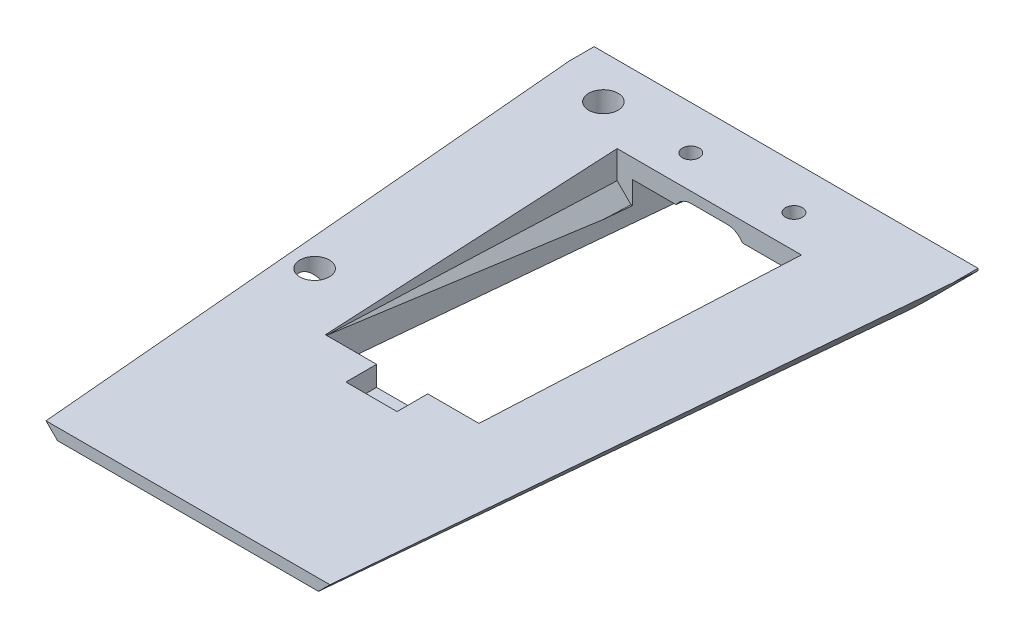
ISO-10303-21;
HEADER;
FILE_DESCRIPTION(('STEP AP214'),'2;1');
FILE_NAME('part.step','',(''),(''),'','','');
FILE_SCHEMA(('AUTOMOTIVE_DESIGN { 1 0 10303 214 1 1 1 1 }'));
ENDSEC;
DATA;
#1=APPLICATION_CONTEXT('core data for automotive mechanical design processes');
#2=APPLICATION_PROTOCOL_DEFINITION('international standard','automotive_design',2000,#1);
#3=PRODUCT_CONTEXT('',#1,'mechanical');
#4=PRODUCT('Part','Part','',(#3));
#5=PRODUCT_RELATED_PRODUCT_CATEGORY('part','',(#4));
#6=PRODUCT_DEFINITION_FORMATION('','',#4);
#7=PRODUCT_DEFINITION_CONTEXT('part definition',#1,'design');
#8=PRODUCT_DEFINITION('design','',#6,#7);
#9=PRODUCT_DEFINITION_SHAPE('','',#8);
#10=(LENGTH_UNIT() NAMED_UNIT(*) SI_UNIT(.MILLI.,.METRE.));
#11=(NAMED_UNIT(*) PLANE_ANGLE_UNIT() SI_UNIT($,.RADIAN.));
#12=(NAMED_UNIT(*) SI_UNIT($,.STERADIAN.) SOLID_ANGLE_UNIT());
#13=UNCERTAINTY_MEASURE_WITH_UNIT(LENGTH_MEASURE(1.E-05),#10,'distance_accuracy_value','');
#14=(GEOMETRIC_REPRESENTATION_CONTEXT(3) GLOBAL_UNCERTAINTY_ASSIGNED_CONTEXT((#13)) GLOBAL_UNIT_ASSIGNED_CONTEXT((#10,
#11,#12)) REPRESENTATION_CONTEXT('',''));
#15=CARTESIAN_POINT('',(0.,0.,0.));
#16=DIRECTION('',(0.,0.,1.));
#17=DIRECTION('',(1.,0.,0.));
#18=AXIS2_PLACEMENT_3D('',#15,#16,#17);
#19=CARTESIAN_POINT('',(166.967269218127,-18.293667746887,-89.9054333669881));
#20=DIRECTION('',(0.,-0.996194698091746,0.0871557427476512));
#21=DIRECTION('',(0.,-0.0871557427476512,-0.996194698091746));
#22=AXIS2_PLACEMENT_3D('',#19,#20,#21);
#23=PLANE('',#22);
#24=CARTESIAN_POINT('',(173.869198236725,-18.7930616119819,-95.6135313647014));
#25=DIRECTION('',(0.,-0.996194698091746,0.0871557427476512));
#26=DIRECTION('',(0.,0.0871557427476512,0.996194698091746));
#27=AXIS2_PLACEMENT_3D('',#24,#25,#26);
#28=ELLIPSE('',#27,1.65630273194654,1.65000000000002);
#29=CARTESIAN_POINT('',(173.869198236725,-18.6487053171641,-93.9635313647014));
#30=VERTEX_POINT('',#29);
#31=EDGE_CURVE('E272',#30,#30,#28,.T.);
#32=ORIENTED_EDGE('',*,*,#31,.F.);
#33=EDGE_LOOP('',(#32));
#34=FACE_BOUND('',#33,.T.);
#35=DIRECTION('',(0.,-0.0871557427476512,-0.996194698091746));
#36=VECTOR('',#35,1.);
#37=CARTESIAN_POINT('',(170.263380121477,-16.9256783104184,-74.2692425585265));
#38=LINE('',#37,#36);
#39=CARTESIAN_POINT('',(170.263380121477,-19.540350592848,-104.155083501279));
#40=VERTEX_POINT('',#39);
#41=CARTESIAN_POINT('',(170.263380121477,-18.2280206399592,-89.1550835012789));
#42=VERTEX_POINT('',#41);
#43=EDGE_CURVE('E438',#40,#42,#38,.F.);
#44=ORIENTED_EDGE('',*,*,#43,.F.);
#45=DIRECTION('',(-1.,0.,0.));
#46=VECTOR('',#45,1.);
#47=CARTESIAN_POINT('',(178.792269218127,-19.540350592848,-104.155083501279));
#48=LINE('',#47,#46);
#49=CARTESIAN_POINT('',(178.792269218127,-19.540350592848,-104.155083501279));
#50=VERTEX_POINT('',#49);
#51=EDGE_CURVE('E297',#50,#40,#48,.T.);
#52=ORIENTED_EDGE('',*,*,#51,.F.);
#53=DIRECTION('',(0.,-0.0871557427476512,-0.996194698091746));
#54=VECTOR('',#53,1.);
#55=CARTESIAN_POINT('',(178.792269218127,-19.7929134595742,-107.041890277695));
#56=LINE('',#55,#54);
#57=CARTESIAN_POINT('',(178.792269218127,-18.2280206399592,-89.1550835012789));
#58=VERTEX_POINT('',#57);
#59=EDGE_CURVE('E301',#58,#50,#56,.T.);
#60=ORIENTED_EDGE('',*,*,#59,.F.);
#61=DIRECTION('',(1.,0.,0.));
#62=VECTOR('',#61,1.);
#63=CARTESIAN_POINT('',(178.792269218127,-18.2280206399592,-89.1550835012789));
#64=LINE('',#63,#62);
#65=EDGE_CURVE('E307',#42,#58,#64,.T.);
#66=ORIENTED_EDGE('',*,*,#65,.F.);
#67=EDGE_LOOP('',(#44,#52,#60,#66));
#68=FACE_BOUND('',#67,.T.);
#69=ADVANCED_FACE('F36',(#34,#68),#23,.T.);
#70=CARTESIAN_POINT('',(0.,-14.5,0.));
#71=DIRECTION('',(0.,1.,0.));
#72=DIRECTION('',(0.,0.,1.));
#73=AXIS2_PLACEMENT_3D('',#70,#71,#72);
#74=PLANE('',#73);
#75=DIRECTION('',(0.,0.,-1.));
#76=VECTOR('',#75,1.);
#77=CARTESIAN_POINT('',(168.792269218127,-14.5000000000001,-23.1550835012789));
#78=LINE('',#77,#76);
#79=CARTESIAN_POINT('',(168.792269218127,-14.5000000000001,-23.1550835012789));
#80=VERTEX_POINT('',#79);
#81=CARTESIAN_POINT('',(168.792269218127,-14.5000000000001,-29.1550835012789));
#82=VERTEX_POINT('',#81);
#83=EDGE_CURVE('E259',#80,#82,#78,.T.);
#84=ORIENTED_EDGE('',*,*,#83,.F.);
#85=DIRECTION('',(1.,0.,0.));
#86=VECTOR('',#85,1.);
#87=CARTESIAN_POINT('',(168.792269218127,-14.5000000000001,-23.1550835012789));
#88=LINE('',#87,#86);
#89=CARTESIAN_POINT('',(158.792269218127,-14.5000000000001,-23.1550835012789));
#90=VERTEX_POINT('',#89);
#91=EDGE_CURVE('E237',#90,#80,#88,.T.);
#92=ORIENTED_EDGE('',*,*,#91,.F.);
#93=DIRECTION('',(0.,0.,-1.));
#94=VECTOR('',#93,1.);
#95=CARTESIAN_POINT('',(158.792269218127,-14.5000000000001,-23.1550835012789));
#96=LINE('',#95,#94);
#97=CARTESIAN_POINT('',(158.792269218127,-14.5000000000001,-29.1550835012789));
#98=VERTEX_POINT('',#97);
#99=EDGE_CURVE('E262',#90,#98,#96,.T.);
#100=ORIENTED_EDGE('',*,*,#99,.T.);
#101=DIRECTION('',(1.,0.,0.));
#102=VECTOR('',#101,1.);
#103=CARTESIAN_POINT('',(148.792269218127,-14.5,-29.1550835012789));
#104=LINE('',#103,#102);
#105=CARTESIAN_POINT('',(148.792269218127,-14.5,-29.1550835012789));
#106=VERTEX_POINT('',#105);
#107=EDGE_CURVE('E354',#106,#98,#104,.T.);
#108=ORIENTED_EDGE('',*,*,#107,.F.);
#109=DIRECTION('',(0.0499376169438923,0.,0.998752338877845));
#110=VECTOR('',#109,1.);
#111=CARTESIAN_POINT('',(145.792269218127,-14.5,-89.1550835012789));
#112=LINE('',#111,#110);
#113=CARTESIAN_POINT('',(145.792269218127,-14.5,-89.1550835012789));
#114=VERTEX_POINT('',#113);
#115=EDGE_CURVE('E346',#114,#106,#112,.T.);
#116=ORIENTED_EDGE('',*,*,#115,.F.);
#117=DIRECTION('',(-1.,0.,0.));
#118=VECTOR('',#117,1.);
#119=CARTESIAN_POINT('',(145.792269218127,-14.5,-89.1550835012789));
#120=LINE('',#119,#118);
#121=CARTESIAN_POINT('',(181.792269218127,-14.5,-89.1550835012789));
#122=VERTEX_POINT('',#121);
#123=EDGE_CURVE('E347',#122,#114,#120,.T.);
#124=ORIENTED_EDGE('',*,*,#123,.F.);
#125=DIRECTION('',(0.0499376169438923,0.,-0.998752338877845));
#126=VECTOR('',#125,1.);
#127=CARTESIAN_POINT('',(181.792269218127,-14.5,-89.1550835012789));
#128=LINE('',#127,#126);
#129=CARTESIAN_POINT('',(178.792269218127,-14.5,-29.1550835012789));
#130=VERTEX_POINT('',#129);
#131=EDGE_CURVE('E351',#130,#122,#128,.T.);
#132=ORIENTED_EDGE('',*,*,#131,.F.);
#133=EDGE_CURVE('E357',#82,#130,#104,.T.);
#134=ORIENTED_EDGE('',*,*,#133,.F.);
#135=EDGE_LOOP('',(#84,#92,#100,#108,#116,#124,#132,#134));
#136=FACE_BOUND('',#135,.T.);
#137=CARTESIAN_POINT('',(173.869198236725,-14.5,-95.6135313647014));
#138=DIRECTION('',(0.,1.,0.));
#139=DIRECTION('',(0.,0.,1.));
#140=AXIS2_PLACEMENT_3D('',#137,#138,#139);
#141=CIRCLE('',#140,1.65000000000002);
#142=CARTESIAN_POINT('',(173.869198236725,-14.5,-93.9635313647014));
#143=VERTEX_POINT('',#142);
#144=EDGE_CURVE('E266',#143,#143,#141,.T.);
#145=ORIENTED_EDGE('',*,*,#144,.F.);
#146=EDGE_LOOP('',(#145));
#147=FACE_BOUND('',#146,.T.);
#148=CARTESIAN_POINT('',(153.715340199529,-14.5,-95.6135313647014));
#149=DIRECTION('',(0.,1.,0.));
#150=DIRECTION('',(0.,0.,1.));
#151=AXIS2_PLACEMENT_3D('',#148,#149,#150);
#152=CIRCLE('',#151,1.65000000000002);
#153=CARTESIAN_POINT('',(153.715340199529,-14.5,-93.9635313647014));
#154=VERTEX_POINT('',#153);
#155=EDGE_CURVE('E261',#154,#154,#152,.T.);
#156=ORIENTED_EDGE('',*,*,#155,.F.);
#157=EDGE_LOOP('',(#156));
#158=FACE_BOUND('',#157,.T.);
#159=CARTESIAN_POINT('',(136.518193503687,-14.5,-39.3205639037492));
#160=DIRECTION('',(0.,1.,0.));
#161=DIRECTION('',(0.,0.,1.));
#162=AXIS2_PLACEMENT_3D('',#159,#160,#161);
#163=CIRCLE('',#162,2.87499999999999);
#164=CARTESIAN_POINT('',(136.518193503687,-14.5,-36.4455639037492));
#165=VERTEX_POINT('',#164);
#166=EDGE_CURVE('E336',#165,#165,#163,.T.);
#167=ORIENTED_EDGE('',*,*,#166,.F.);
#168=EDGE_LOOP('',(#167));
#169=FACE_BOUND('',#168,.T.);
#170=CARTESIAN_POINT('',(136.518193503687,-14.5,-95.7385326925261));
#171=DIRECTION('',(0.,1.,0.));
#172=DIRECTION('',(0.,0.,1.));
#173=AXIS2_PLACEMENT_3D('',#170,#171,#172);
#174=CIRCLE('',#173,2.87499999999999);
#175=CARTESIAN_POINT('',(136.518193503687,-14.5,-92.8635326925261));
#176=VERTEX_POINT('',#175);
#177=EDGE_CURVE('E337',#176,#176,#174,.T.);
#178=ORIENTED_EDGE('',*,*,#177,.F.);
#179=EDGE_LOOP('',(#178));
#180=FACE_BOUND('',#179,.T.);
#181=DIRECTION('',(0.,0.,1.));
#182=VECTOR('',#181,1.);
#183=CARTESIAN_POINT('',(201.292269218127,-14.5,-104.155083501279));
#184=LINE('',#183,#182);
#185=CARTESIAN_POINT('',(201.292269218127,-14.5,-104.155083501279));
#186=VERTEX_POINT('',#185);
#187=CARTESIAN_POINT('',(201.292269218127,-14.5,-99.3226935308539));
#188=VERTEX_POINT('',#187);
#189=EDGE_CURVE('E378',#186,#188,#184,.T.);
#190=ORIENTED_EDGE('',*,*,#189,.F.);
#191=DIRECTION('',(1.,0.,0.));
#192=VECTOR('',#191,1.);
#193=CARTESIAN_POINT('',(126.292269218127,-14.5,-104.155083501279));
#194=LINE('',#193,#192);
#195=CARTESIAN_POINT('',(126.292269218127,-14.5,-104.155083501279));
#196=VERTEX_POINT('',#195);
#197=EDGE_CURVE('E382',#196,#186,#194,.T.);
#198=ORIENTED_EDGE('',*,*,#197,.F.);
#199=DIRECTION('',(0.,0.,-1.));
#200=VECTOR('',#199,1.);
#201=CARTESIAN_POINT('',(126.292269218127,-14.5,-104.155083501279));
#202=LINE('',#201,#200);
#203=CARTESIAN_POINT('',(126.292269218127,-14.5,-99.3226935308538));
#204=VERTEX_POINT('',#203);
#205=EDGE_CURVE('E373',#204,#196,#202,.T.);
#206=ORIENTED_EDGE('',*,*,#205,.F.);
#207=DIRECTION('',(0.0868265938642417,0.,0.996223440096615));
#208=VECTOR('',#207,1.);
#209=CARTESIAN_POINT('',(133.931452491663,-14.5,-11.6728952191828));
#210=LINE('',#209,#208);
#211=CARTESIAN_POINT('',(136.055408037731,-14.5,12.6967616629529));
#212=VERTEX_POINT('',#211);
#213=EDGE_CURVE('E403',#204,#212,#210,.T.);
#214=ORIENTED_EDGE('',*,*,#213,.T.);
#215=DIRECTION('',(-1.,0.,0.));
#216=VECTOR('',#215,1.);
#217=CARTESIAN_POINT('',(126.292269218127,-14.5,12.6967616629529));
#218=LINE('',#217,#216);
#219=CARTESIAN_POINT('',(191.529130398524,-14.5,12.6967616629529));
#220=VERTEX_POINT('',#219);
#221=EDGE_CURVE('E374',#220,#212,#218,.T.);
#222=ORIENTED_EDGE('',*,*,#221,.F.);
#223=DIRECTION('',(0.0868265938642418,0.,-0.996223440096615));
#224=VECTOR('',#223,1.);
#225=CARTESIAN_POINT('',(191.183472822199,-14.5,16.6627375748944));
#226=LINE('',#225,#224);
#227=EDGE_CURVE('E405',#220,#188,#226,.T.);
#228=ORIENTED_EDGE('',*,*,#227,.T.);
#229=EDGE_LOOP('',(#190,#198,#206,#214,#222,#228));
#230=FACE_BOUND('',#229,.T.);
#231=ADVANCED_FACE('F483',(#136,#147,#158,#169,#180,#230),#74,.T.);
#232=CARTESIAN_POINT('',(0.,-17.7205902201383,1.55035075525034));
#233=DIRECTION('',(0.,-0.996194698091746,0.0871557427476512));
#234=DIRECTION('',(0.,-0.0871557427476512,-0.996194698091746));
#235=AXIS2_PLACEMENT_3D('',#232,#233,#234);
#236=PLANE('',#235);
#237=DIRECTION('',(1.,0.,0.));
#238=VECTOR('',#237,1.);
#239=CARTESIAN_POINT('',(0.,-20.406967626225,-29.1550835012789));
#240=LINE('',#239,#238);
#241=CARTESIAN_POINT('',(148.792269218127,-20.406967626225,-29.1550835012789));
#242=VERTEX_POINT('',#241);
#243=CARTESIAN_POINT('',(178.792269218127,-20.406967626225,-29.1550835012789));
#244=VERTEX_POINT('',#243);
#245=EDGE_CURVE('E324',#242,#244,#240,.T.);
#246=ORIENTED_EDGE('',*,*,#245,.T.);
#247=DIRECTION('',(0.,-0.0871557427476512,-0.996194698091746));
#248=VECTOR('',#247,1.);
#249=CARTESIAN_POINT('',(178.792269218127,-17.7205902201383,1.55035075525034));
#250=LINE('',#249,#248);
#251=CARTESIAN_POINT('',(178.792269218127,-26.8479421140517,-102.775758777896));
#252=VERTEX_POINT('',#251);
#253=EDGE_CURVE('E333',#244,#252,#250,.T.);
#254=ORIENTED_EDGE('',*,*,#253,.T.);
#255=DIRECTION('',(1.,0.,0.));
#256=VECTOR('',#255,1.);
#257=CARTESIAN_POINT('',(189.292269218127,-26.8479421140517,-102.775758777896));
#258=LINE('',#257,#256);
#259=CARTESIAN_POINT('',(189.292269218127,-26.8479421140517,-102.775758777896));
#260=VERTEX_POINT('',#259);
#261=EDGE_CURVE('E416',#252,#260,#258,.T.);
#262=ORIENTED_EDGE('',*,*,#261,.T.);
#263=DIRECTION('',(0.,0.0871557427476512,0.996194698091746));
#264=VECTOR('',#263,1.);
#265=CARTESIAN_POINT('',(189.292269218127,-16.7454056267127,12.6967616629529));
#266=LINE('',#265,#264);
#267=CARTESIAN_POINT('',(189.292269218127,-16.7454056267127,12.6967616629529));
#268=VERTEX_POINT('',#267);
#269=EDGE_CURVE('E396',#260,#268,#266,.T.);
#270=ORIENTED_EDGE('',*,*,#269,.T.);
#271=DIRECTION('',(-1.,0.,0.));
#272=VECTOR('',#271,1.);
#273=CARTESIAN_POINT('',(126.292269218127,-16.7454056267127,12.6967616629529));
#274=LINE('',#273,#272);
#275=CARTESIAN_POINT('',(138.292269218127,-16.7454056267127,12.6967616629529));
#276=VERTEX_POINT('',#275);
#277=EDGE_CURVE('E377',#268,#276,#274,.T.);
#278=ORIENTED_EDGE('',*,*,#277,.T.);
#279=DIRECTION('',(0.,-0.0871557427476512,-0.996194698091746));
#280=VECTOR('',#279,1.);
#281=CARTESIAN_POINT('',(138.292269218127,-26.9686173906688,-104.155083501279));
#282=LINE('',#281,#280);
#283=CARTESIAN_POINT('',(138.292269218127,-21.0984009211668,-37.0582022263351));
#284=VERTEX_POINT('',#283);
#285=EDGE_CURVE('E393',#276,#284,#282,.T.);
#286=ORIENTED_EDGE('',*,*,#285,.T.);
#287=CARTESIAN_POINT('',(136.518193503687,-21.296331920736,-39.3205639037492));
#288=DIRECTION('',(0.,-0.996194698091746,0.0871557427476512));
#289=DIRECTION('',(0.,0.0871557427476512,0.996194698091746));
#290=AXIS2_PLACEMENT_3D('',#287,#288,#289);
#291=ELLIPSE('',#290,2.88598203293711,2.87499999999999);
#292=CARTESIAN_POINT('',(138.292269218127,-21.4942629203052,-41.5829255811633));
#293=VERTEX_POINT('',#292);
#294=EDGE_CURVE('E340',#293,#284,#291,.T.);
#295=ORIENTED_EDGE('',*,*,#294,.F.);
#296=CARTESIAN_POINT('',(138.292269218127,-26.0343336093438,-93.476171015112));
#297=VERTEX_POINT('',#296);
#298=EDGE_CURVE('E397',#293,#297,#282,.T.);
#299=ORIENTED_EDGE('',*,*,#298,.T.);
#300=CARTESIAN_POINT('',(136.518193503687,-26.232264608913,-95.7385326925261));
#301=DIRECTION('',(0.,-0.996194698091746,0.0871557427476512));
#302=DIRECTION('',(0.,0.0871557427476512,0.996194698091746));
#303=AXIS2_PLACEMENT_3D('',#300,#301,#302);
#304=ELLIPSE('',#303,2.88598203293711,2.87499999999999);
#305=CARTESIAN_POINT('',(138.292269218127,-26.4301956084822,-98.0008943699402));
#306=VERTEX_POINT('',#305);
#307=EDGE_CURVE('E344',#306,#297,#304,.T.);
#308=ORIENTED_EDGE('',*,*,#307,.F.);
#309=CARTESIAN_POINT('',(138.292269218127,-26.8479421140517,-102.775758777896));
#310=VERTEX_POINT('',#309);
#311=EDGE_CURVE('E389',#306,#310,#282,.T.);
#312=ORIENTED_EDGE('',*,*,#311,.T.);
#313=CARTESIAN_POINT('',(148.792269218127,-26.8479421140517,-102.775758777896));
#314=VERTEX_POINT('',#313);
#315=EDGE_CURVE('E417',#310,#314,#258,.T.);
#316=ORIENTED_EDGE('',*,*,#315,.T.);
#317=DIRECTION('',(0.,-0.0871557427476512,-0.996194698091746));
#318=VECTOR('',#317,1.);
#319=CARTESIAN_POINT('',(148.792269218127,-17.7205902201383,1.55035075525034));
#320=LINE('',#319,#318);
#321=EDGE_CURVE('E322',#242,#314,#320,.T.);
#322=ORIENTED_EDGE('',*,*,#321,.F.);
#323=EDGE_LOOP('',(#246,#254,#262,#270,#278,#286,#295,#299,#308,#312,#316,#322));
#324=FACE_BOUND('',#323,.T.);
#325=ADVANCED_FACE('F525',(#324),#236,.T.);
#326=CARTESIAN_POINT('',(0.,-26.8479421140517,-102.775758777896));
#327=DIRECTION('',(0.,-0.707106781186551,-0.707106781186544));
#328=DIRECTION('',(-1.,0.,0.));
#329=AXIS2_PLACEMENT_3D('',#326,#327,#328);
#330=PLANE('',#329);
#331=ORIENTED_EDGE('',*,*,#261,.F.);
#332=DIRECTION('',(0.,0.707106781186544,-0.707106781186551));
#333=VECTOR('',#332,1.);
#334=CARTESIAN_POINT('',(178.792269218127,-26.8479421140517,-102.775758777896));
#335=LINE('',#334,#333);
#336=CARTESIAN_POINT('',(178.792269218127,-25.4686173906688,-104.155083501279));
#337=VERTEX_POINT('',#336);
#338=EDGE_CURVE('E330',#252,#337,#335,.T.);
#339=ORIENTED_EDGE('',*,*,#338,.T.);
#340=DIRECTION('',(-1.,0.,0.));
#341=VECTOR('',#340,1.);
#342=CARTESIAN_POINT('',(138.292269218127,-25.4686173906688,-104.155083501279));
#343=LINE('',#342,#341);
#344=CARTESIAN_POINT('',(190.786561265265,-25.4686173906688,-104.155083501279));
#345=VERTEX_POINT('',#344);
#346=EDGE_CURVE('E423',#345,#337,#343,.T.);
#347=ORIENTED_EDGE('',*,*,#346,.F.);
#348=DIRECTION('',(0.608120402411343,0.561333045602635,-0.561333045602641));
#349=VECTOR('',#348,1.);
#350=CARTESIAN_POINT('',(156.795404322521,-56.8445744783919,-72.7791264135555));
#351=LINE('',#350,#349);
#352=EDGE_CURVE('E420',#260,#345,#351,.T.);
#353=ORIENTED_EDGE('',*,*,#352,.F.);
#354=EDGE_LOOP('',(#331,#339,#347,#353));
#355=FACE_BOUND('',#354,.T.);
#356=ADVANCED_FACE('F522',(#355),#330,.T.);
#357=CARTESIAN_POINT('',(0.,-14.7320061258631,1.28888352700738));
#358=DIRECTION('',(0.,-0.996194698091746,0.0871557427476512));
#359=DIRECTION('',(0.,-0.0871557427476512,-0.996194698091746));
#360=AXIS2_PLACEMENT_3D('',#357,#358,#359);
#361=PLANE('',#360);
#362=DIRECTION('',(0.,-0.0871557427476512,-0.996194698091746));
#363=VECTOR('',#362,1.);
#364=CARTESIAN_POINT('',(178.792269218127,-14.7320061258631,1.28888352700738));
#365=LINE('',#364,#363);
#366=CARTESIAN_POINT('',(178.792269218127,-22.1464758130355,-83.458892794619));
#367=VERTEX_POINT('',#366);
#368=CARTESIAN_POINT('',(178.792269218127,-22.64482792515,-89.1550835012789));
#369=VERTEX_POINT('',#368);
#370=EDGE_CURVE('E327',#367,#369,#365,.T.);
#371=ORIENTED_EDGE('',*,*,#370,.F.);
#372=DIRECTION('',(0.0497480604246178,-0.0870478263911274,-0.994961208492356));
#373=VECTOR('',#372,1.);
#374=CARTESIAN_POINT('',(179.083798495571,-22.6565859502809,-89.2894783435023));
#375=LINE('',#374,#373);
#376=CARTESIAN_POINT('',(179.07707875346,-22.64482792515,-89.1550835012789));
#377=VERTEX_POINT('',#376);
#378=EDGE_CURVE('E443',#367,#377,#375,.T.);
#379=ORIENTED_EDGE('',*,*,#378,.T.);
#380=DIRECTION('',(-1.,0.,0.));
#381=VECTOR('',#380,1.);
#382=CARTESIAN_POINT('',(145.792269218127,-22.64482792515,-89.1550835012789));
#383=LINE('',#382,#381);
#384=EDGE_CURVE('E360',#377,#369,#383,.T.);
#385=ORIENTED_EDGE('',*,*,#384,.T.);
#386=EDGE_LOOP('',(#371,#379,#385));
#387=FACE_BOUND('',#386,.T.);
#388=ADVANCED_FACE('F468',(#387),#361,.F.);
#389=CARTESIAN_POINT('',(126.292269218127,-160.972316362105,-104.155083501279));
#390=DIRECTION('',(1.,0.,0.));
#391=DIRECTION('',(0.,0.,-1.));
#392=AXIS2_PLACEMENT_3D('',#389,#390,#391);
#393=PLANE('',#392);
#394=DIRECTION('',(0.,1.,0.));
#395=VECTOR('',#394,1.);
#396=CARTESIAN_POINT('',(126.292269218127,-160.972316362105,-104.155083501279));
#397=LINE('',#396,#395);
#398=CARTESIAN_POINT('',(126.292269218127,-14.9227793401485,-104.155083501279));
#399=VERTEX_POINT('',#398);
#400=EDGE_CURVE('E384',#399,#196,#397,.T.);
#401=ORIENTED_EDGE('',*,*,#400,.F.);
#402=DIRECTION('',(0.,0.0871557427476512,0.996194698091746));
#403=VECTOR('',#402,1.);
#404=CARTESIAN_POINT('',(126.292269218127,-4.79106924961172,11.6508927499811));
#405=LINE('',#404,#403);
#406=EDGE_CURVE('E414',#399,#204,#405,.T.);
#407=ORIENTED_EDGE('',*,*,#406,.T.);
#408=ORIENTED_EDGE('',*,*,#205,.T.);
#409=EDGE_LOOP('',(#401,#407,#408));
#410=FACE_BOUND('',#409,.T.);
#411=ADVANCED_FACE('F615',(#410),#393,.F.);
#412=CARTESIAN_POINT('',(126.292269218127,-160.972316362105,-104.155083501279));
#413=DIRECTION('',(0.,0.,1.));
#414=DIRECTION('',(1.,0.,0.));
#415=AXIS2_PLACEMENT_3D('',#412,#413,#414);
#416=PLANE('',#415);
#417=ORIENTED_EDGE('',*,*,#51,.T.);
#418=CARTESIAN_POINT('',(167.292269218127,-21.3974172923032,-104.155083501279));
#419=DIRECTION('',(0.,0.,1.));
#420=DIRECTION('',(0.,-1.,0.));
#421=AXIS2_PLACEMENT_3D('',#418,#419,#420);
#422=ELLIPSE('',#421,3.51336943140171,3.5);
#423=CARTESIAN_POINT('',(167.292269218127,-17.8840478609015,-104.155083501279));
#424=VERTEX_POINT('',#423);
#425=EDGE_CURVE('E290',#40,#424,#422,.T.);
#426=ORIENTED_EDGE('',*,*,#425,.T.);
#427=DIRECTION('',(-1.,0.,0.));
#428=VECTOR('',#427,1.);
#429=CARTESIAN_POINT('',(126.292269218127,-17.8840478609014,-104.155083501279));
#430=LINE('',#429,#428);
#431=CARTESIAN_POINT('',(160.292269218127,-17.8840478609015,-104.155083501279));
#432=VERTEX_POINT('',#431);
#433=EDGE_CURVE('E293',#424,#432,#430,.T.);
#434=ORIENTED_EDGE('',*,*,#433,.T.);
#435=CARTESIAN_POINT('',(160.292269218127,-21.3974172923032,-104.155083501279));
#436=DIRECTION('',(0.,0.,1.));
#437=DIRECTION('',(0.,-1.,0.));
#438=AXIS2_PLACEMENT_3D('',#435,#436,#437);
#439=ELLIPSE('',#438,3.51336943140172,3.5);
#440=CARTESIAN_POINT('',(157.321158314778,-19.540350592848,-104.155083501279));
#441=VERTEX_POINT('',#440);
#442=EDGE_CURVE('E284',#432,#441,#439,.T.);
#443=ORIENTED_EDGE('',*,*,#442,.T.);
#444=CARTESIAN_POINT('',(148.792269218127,-19.540350592848,-104.155083501279));
#445=VERTEX_POINT('',#444);
#446=EDGE_CURVE('E296',#441,#445,#48,.T.);
#447=ORIENTED_EDGE('',*,*,#446,.T.);
#448=DIRECTION('',(0.,1.,0.));
#449=VECTOR('',#448,1.);
#450=CARTESIAN_POINT('',(148.792269218127,-26.8479421140517,-104.155083501279));
#451=LINE('',#450,#449);
#452=CARTESIAN_POINT('',(148.792269218127,-25.4686173906688,-104.155083501279));
#453=VERTEX_POINT('',#452);
#454=EDGE_CURVE('E303',#453,#445,#451,.T.);
#455=ORIENTED_EDGE('',*,*,#454,.F.);
#456=CARTESIAN_POINT('',(136.79797717099,-25.4686173906688,-104.155083501279));
#457=VERTEX_POINT('',#456);
#458=EDGE_CURVE('E422',#453,#457,#343,.T.);
#459=ORIENTED_EDGE('',*,*,#458,.T.);
#460=DIRECTION('',(-0.705757556807957,0.708453436019943,0.));
#461=VECTOR('',#460,1.);
#462=CARTESIAN_POINT('',(133.668289239105,-22.3269745593229,-104.155083501279));
#463=LINE('',#462,#461);
#464=EDGE_CURVE('E409',#457,#399,#463,.T.);
#465=ORIENTED_EDGE('',*,*,#464,.T.);
#466=ORIENTED_EDGE('',*,*,#400,.T.);
#467=ORIENTED_EDGE('',*,*,#197,.T.);
#468=DIRECTION('',(0.,1.,0.));
#469=VECTOR('',#468,1.);
#470=CARTESIAN_POINT('',(201.292269218127,-160.972316362105,-104.155083501279));
#471=LINE('',#470,#469);
#472=CARTESIAN_POINT('',(201.292269218127,-14.9227793401485,-104.155083501279));
#473=VERTEX_POINT('',#472);
#474=EDGE_CURVE('E381',#473,#186,#471,.T.);
#475=ORIENTED_EDGE('',*,*,#474,.F.);
#476=DIRECTION('',(-0.705757556807956,-0.708453436019944,0.));
#477=VECTOR('',#476,1.);
#478=CARTESIAN_POINT('',(193.916249197149,-22.3269745593229,-104.155083501279));
#479=LINE('',#478,#477);
#480=EDGE_CURVE('E411',#473,#345,#479,.T.);
#481=ORIENTED_EDGE('',*,*,#480,.T.);
#482=ORIENTED_EDGE('',*,*,#346,.T.);
#483=DIRECTION('',(0.,1.,0.));
#484=VECTOR('',#483,1.);
#485=CARTESIAN_POINT('',(178.792269218127,-26.8479421140517,-104.155083501279));
#486=LINE('',#485,#484);
#487=EDGE_CURVE('E310',#337,#50,#486,.T.);
#488=ORIENTED_EDGE('',*,*,#487,.T.);
#489=EDGE_LOOP('',(#417,#426,#434,#443,#447,#455,#459,#465,#466,#467,#475,#481,#482,#488));
#490=FACE_BOUND('',#489,.T.);
#491=ADVANCED_FACE('F504',(#490),#416,.F.);
#492=CARTESIAN_POINT('',(201.292269218127,-160.972316362105,-104.155083501279));
#493=DIRECTION('',(-1.,0.,0.));
#494=DIRECTION('',(0.,0.,1.));
#495=AXIS2_PLACEMENT_3D('',#492,#493,#494);
#496=PLANE('',#495);
#497=ORIENTED_EDGE('',*,*,#189,.T.);
#498=DIRECTION('',(0.,-0.0871557427476512,-0.996194698091746));
#499=VECTOR('',#498,1.);
#500=CARTESIAN_POINT('',(201.292269218127,-15.0142810135677,-105.200952414251));
#501=LINE('',#500,#499);
#502=EDGE_CURVE('E407',#188,#473,#501,.T.);
#503=ORIENTED_EDGE('',*,*,#502,.T.);
#504=ORIENTED_EDGE('',*,*,#474,.T.);
#505=EDGE_LOOP('',(#497,#503,#504));
#506=FACE_BOUND('',#505,.T.);
#507=ADVANCED_FACE('F586',(#506),#496,.F.);
#508=CARTESIAN_POINT('',(126.292269218127,-160.972316362105,12.6967616629529));
#509=DIRECTION('',(0.,0.,-1.));
#510=DIRECTION('',(-1.,0.,0.));
#511=AXIS2_PLACEMENT_3D('',#508,#509,#510);
#512=PLANE('',#511);
#513=ORIENTED_EDGE('',*,*,#277,.F.);
#514=DIRECTION('',(0.705757556807956,0.708453436019944,0.));
#515=VECTOR('',#514,1.);
#516=CARTESIAN_POINT('',(188.80468046512,-17.2348568895439,12.6967616629529));
#517=LINE('',#516,#515);
#518=EDGE_CURVE('E401',#268,#220,#517,.T.);
#519=ORIENTED_EDGE('',*,*,#518,.T.);
#520=ORIENTED_EDGE('',*,*,#221,.T.);
#521=DIRECTION('',(0.705757556807957,-0.708453436019943,0.));
#522=VECTOR('',#521,1.);
#523=CARTESIAN_POINT('',(138.779857971134,-17.2348568895439,12.6967616629529));
#524=LINE('',#523,#522);
#525=EDGE_CURVE('E399',#212,#276,#524,.T.);
#526=ORIENTED_EDGE('',*,*,#525,.T.);
#527=EDGE_LOOP('',(#513,#519,#520,#526));
#528=FACE_BOUND('',#527,.T.);
#529=ADVANCED_FACE('F616',(#528),#512,.F.);
#530=CARTESIAN_POINT('',(189.292269218127,-17.7205902201383,1.55035075525038));
#531=DIRECTION('',(0.707106781186544,-0.704416026402763,0.0616284167162149));
#532=DIRECTION('',(0.,-0.0871557427476512,-0.996194698091746));
#533=AXIS2_PLACEMENT_3D('',#530,#531,#532);
#534=PLANE('',#533);
#535=ORIENTED_EDGE('',*,*,#269,.F.);
#536=ORIENTED_EDGE('',*,*,#352,.T.);
#537=ORIENTED_EDGE('',*,*,#480,.F.);
#538=ORIENTED_EDGE('',*,*,#502,.F.);
#539=ORIENTED_EDGE('',*,*,#227,.F.);
#540=ORIENTED_EDGE('',*,*,#518,.F.);
#541=EDGE_LOOP('',(#535,#536,#537,#538,#539,#540));
#542=FACE_BOUND('',#541,.T.);
#543=ADVANCED_FACE('F588',(#542),#534,.T.);
#544=CARTESIAN_POINT('',(138.292269218127,-17.7205902201383,1.55035075525037));
#545=DIRECTION('',(-0.707106781186542,-0.704416026402764,0.0616284167162147));
#546=DIRECTION('',(0.,0.0871557427476512,0.996194698091746));
#547=AXIS2_PLACEMENT_3D('',#544,#545,#546);
#548=PLANE('',#547);
#549=CARTESIAN_POINT('',(136.518193503687,-24.4514122134536,-95.7385326925261));
#550=DIRECTION('',(-0.707106781186542,-0.704416026402764,0.0616284167162147));
#551=DIRECTION('',(-0.70175575708215,0.709787335578017,0.0611620442359357));
#552=AXIS2_PLACEMENT_3D('',#549,#550,#551);
#553=ELLIPSE('',#552,4.08139493174471,2.87499999999999);
#554=EDGE_CURVE('E431',#297,#306,#553,.T.);
#555=ORIENTED_EDGE('',*,*,#554,.F.);
#556=ORIENTED_EDGE('',*,*,#298,.F.);
#557=CARTESIAN_POINT('',(136.518193503687,-19.5154795252766,-39.3205639037492));
#558=DIRECTION('',(-0.707106781186542,-0.704416026402764,0.0616284167162147));
#559=DIRECTION('',(-0.70175575708215,0.709787335578017,0.0611620442359357));
#560=AXIS2_PLACEMENT_3D('',#557,#558,#559);
#561=ELLIPSE('',#560,4.08139493174471,2.87499999999999);
#562=EDGE_CURVE('E429',#284,#293,#561,.T.);
#563=ORIENTED_EDGE('',*,*,#562,.F.);
#564=ORIENTED_EDGE('',*,*,#285,.F.);
#565=ORIENTED_EDGE('',*,*,#525,.F.);
#566=ORIENTED_EDGE('',*,*,#213,.F.);
#567=ORIENTED_EDGE('',*,*,#406,.F.);
#568=ORIENTED_EDGE('',*,*,#464,.F.);
#569=DIRECTION('',(0.608120402411344,-0.561333045602634,0.56133304560264));
#570=VECTOR('',#569,1.);
#571=CARTESIAN_POINT('',(170.789134113733,-56.8445744783918,-72.7791264135556));
#572=LINE('',#571,#570);
#573=EDGE_CURVE('E426',#457,#310,#572,.T.);
#574=ORIENTED_EDGE('',*,*,#573,.T.);
#575=ORIENTED_EDGE('',*,*,#311,.F.);
#576=EDGE_LOOP('',(#555,#556,#563,#564,#565,#566,#567,#568,#574,#575));
#577=FACE_BOUND('',#576,.T.);
#578=ADVANCED_FACE('F598',(#577),#548,.T.);
#579=DIRECTION('',(0.,0.707106781186544,-0.707106781186551));
#580=VECTOR('',#579,1.);
#581=CARTESIAN_POINT('',(148.792269218127,-26.8479421140517,-102.775758777896));
#582=LINE('',#581,#580);
#583=EDGE_CURVE('E320',#314,#453,#582,.T.);
#584=ORIENTED_EDGE('',*,*,#583,.F.);
#585=ORIENTED_EDGE('',*,*,#315,.F.);
#586=ORIENTED_EDGE('',*,*,#573,.F.);
#587=ORIENTED_EDGE('',*,*,#458,.F.);
#588=EDGE_LOOP('',(#584,#585,#586,#587));
#589=FACE_BOUND('',#588,.T.);
#590=ADVANCED_FACE('F612',(#589),#330,.T.);
#591=CARTESIAN_POINT('',(148.792269218127,-22.64482792515,-89.1550835012789));
#592=VERTEX_POINT('',#591);
#593=CARTESIAN_POINT('',(148.507459682794,-22.64482792515,-89.1550835012789));
#594=VERTEX_POINT('',#593);
#595=EDGE_CURVE('E363',#592,#594,#383,.T.);
#596=ORIENTED_EDGE('',*,*,#595,.T.);
#597=DIRECTION('',(0.0497480604246178,0.0870478263911274,0.994961208492356));
#598=VECTOR('',#597,1.);
#599=CARTESIAN_POINT('',(151.500739940683,-17.4072661387258,-29.2894783435023));
#600=LINE('',#599,#598);
#601=CARTESIAN_POINT('',(148.792269218127,-22.1464758130357,-83.4588927946207));
#602=VERTEX_POINT('',#601);
#603=EDGE_CURVE('E455',#594,#602,#600,.T.);
#604=ORIENTED_EDGE('',*,*,#603,.T.);
#605=DIRECTION('',(0.,-0.0871557427476512,-0.996194698091746));
#606=VECTOR('',#605,1.);
#607=CARTESIAN_POINT('',(148.792269218127,-14.7320061258631,1.28888352700738));
#608=LINE('',#607,#606);
#609=EDGE_CURVE('E318',#602,#592,#608,.T.);
#610=ORIENTED_EDGE('',*,*,#609,.T.);
#611=EDGE_LOOP('',(#596,#604,#610));
#612=FACE_BOUND('',#611,.T.);
#613=ADVANCED_FACE('F492',(#612),#361,.F.);
#614=CARTESIAN_POINT('',(148.792269218127,-90.1252304912843,-29.1550835012789));
#615=DIRECTION('',(0.,0.,1.));
#616=DIRECTION('',(1.,0.,0.));
#617=AXIS2_PLACEMENT_3D('',#614,#615,#616);
#618=PLANE('',#617);
#619=DIRECTION('',(-1.,0.,0.));
#620=VECTOR('',#619,1.);
#621=CARTESIAN_POINT('',(168.792269218127,-18.406967626225,-29.1550835012789));
#622=LINE('',#621,#620);
#623=CARTESIAN_POINT('',(168.792269218127,-18.406967626225,-29.1550835012789));
#624=VERTEX_POINT('',#623);
#625=CARTESIAN_POINT('',(158.792269218127,-18.406967626225,-29.1550835012789));
#626=VERTEX_POINT('',#625);
#627=EDGE_CURVE('E252',#624,#626,#622,.T.);
#628=ORIENTED_EDGE('',*,*,#627,.F.);
#629=DIRECTION('',(0.,-1.,0.));
#630=VECTOR('',#629,1.);
#631=CARTESIAN_POINT('',(168.792269218127,-18.406967626225,-29.1550835012789));
#632=LINE('',#631,#630);
#633=EDGE_CURVE('E232',#82,#624,#632,.T.);
#634=ORIENTED_EDGE('',*,*,#633,.F.);
#635=ORIENTED_EDGE('',*,*,#133,.T.);
#636=DIRECTION('',(0.,1.,0.));
#637=VECTOR('',#636,1.);
#638=CARTESIAN_POINT('',(178.792269218127,-90.1252304912843,-29.1550835012789));
#639=LINE('',#638,#637);
#640=CARTESIAN_POINT('',(178.792269218127,-14.6852202230184,-29.1550835012789));
#641=VERTEX_POINT('',#640);
#642=EDGE_CURVE('E350',#641,#130,#639,.T.);
#643=ORIENTED_EDGE('',*,*,#642,.F.);
#644=EDGE_CURVE('E368',#244,#641,#639,.T.);
#645=ORIENTED_EDGE('',*,*,#644,.F.);
#646=ORIENTED_EDGE('',*,*,#245,.F.);
#647=DIRECTION('',(0.,1.,0.));
#648=VECTOR('',#647,1.);
#649=CARTESIAN_POINT('',(148.792269218127,-90.1252304912843,-29.1550835012789));
#650=LINE('',#649,#648);
#651=CARTESIAN_POINT('',(148.792269218127,-14.6852202230184,-29.1550835012789));
#652=VERTEX_POINT('',#651);
#653=EDGE_CURVE('E370',#242,#652,#650,.T.);
#654=ORIENTED_EDGE('',*,*,#653,.T.);
#655=EDGE_CURVE('E365',#652,#106,#650,.T.);
#656=ORIENTED_EDGE('',*,*,#655,.T.);
#657=ORIENTED_EDGE('',*,*,#107,.T.);
#658=DIRECTION('',(0.,1.,0.));
#659=VECTOR('',#658,1.);
#660=CARTESIAN_POINT('',(158.792269218127,-14.5000000000001,-29.1550835012789));
#661=LINE('',#660,#659);
#662=EDGE_CURVE('E250',#626,#98,#661,.T.);
#663=ORIENTED_EDGE('',*,*,#662,.F.);
#664=EDGE_LOOP('',(#628,#634,#635,#643,#645,#646,#654,#656,#657,#663));
#665=FACE_BOUND('',#664,.T.);
#666=ADVANCED_FACE('F529',(#665),#618,.F.);
#667=CARTESIAN_POINT('',(181.792269218127,-90.1252304912843,-89.1550835012789));
#668=DIRECTION('',(0.998752338877845,0.,0.0499376169438923));
#669=DIRECTION('',(0.0499376169438923,0.,-0.998752338877845));
#670=AXIS2_PLACEMENT_3D('',#667,#668,#669);
#671=PLANE('',#670);
#672=DIRECTION('',(0.,1.,0.));
#673=VECTOR('',#672,1.);
#674=CARTESIAN_POINT('',(181.792269218127,-90.1252304912843,-89.1550835012789));
#675=LINE('',#674,#673);
#676=CARTESIAN_POINT('',(181.792269218127,-19.9345400345735,-89.1550835012789));
#677=VERTEX_POINT('',#676);
#678=EDGE_CURVE('E366',#677,#122,#675,.T.);
#679=ORIENTED_EDGE('',*,*,#678,.F.);
#680=DIRECTION('',(-0.0497480604246178,0.0870478263911274,0.994961208492356));
#681=VECTOR('',#680,1.);
#682=CARTESIAN_POINT('',(178.804006012855,-14.7057569527139,-29.3898193958253));
#683=LINE('',#682,#681);
#684=EDGE_CURVE('E452',#677,#641,#683,.T.);
#685=ORIENTED_EDGE('',*,*,#684,.T.);
#686=ORIENTED_EDGE('',*,*,#642,.T.);
#687=ORIENTED_EDGE('',*,*,#131,.T.);
#688=EDGE_LOOP('',(#679,#685,#686,#687));
#689=FACE_BOUND('',#688,.T.);
#690=ADVANCED_FACE('F475',(#689),#671,.F.);
#691=CARTESIAN_POINT('',(145.792269218127,-90.1252304912843,-89.1550835012789));
#692=DIRECTION('',(0.,0.,-1.));
#693=DIRECTION('',(-1.,0.,0.));
#694=AXIS2_PLACEMENT_3D('',#691,#692,#693);
#695=PLANE('',#694);
#696=ORIENTED_EDGE('',*,*,#384,.F.);
#697=DIRECTION('',(-0.707745448503642,-0.706467536495753,0.));
#698=VECTOR('',#697,1.);
#699=CARTESIAN_POINT('',(180.92985792003,-20.7953941545126,-89.1550835012789));
#700=LINE('',#699,#698);
#701=EDGE_CURVE('E450',#377,#677,#700,.F.);
#702=ORIENTED_EDGE('',*,*,#701,.T.);
#703=ORIENTED_EDGE('',*,*,#678,.T.);
#704=ORIENTED_EDGE('',*,*,#123,.T.);
#705=DIRECTION('',(0.,1.,0.));
#706=VECTOR('',#705,1.);
#707=CARTESIAN_POINT('',(145.792269218127,-90.1252304912843,-89.1550835012789));
#708=LINE('',#707,#706);
#709=CARTESIAN_POINT('',(145.792269218127,-19.9345400345735,-89.1550835012789));
#710=VERTEX_POINT('',#709);
#711=EDGE_CURVE('E362',#710,#114,#708,.T.);
#712=ORIENTED_EDGE('',*,*,#711,.F.);
#713=DIRECTION('',(-0.707745448503646,0.706467536495749,0.));
#714=VECTOR('',#713,1.);
#715=CARTESIAN_POINT('',(146.957878229526,-21.0980444110991,-89.1550835012789));
#716=LINE('',#715,#714);
#717=EDGE_CURVE('E448',#710,#594,#716,.F.);
#718=ORIENTED_EDGE('',*,*,#717,.T.);
#719=ORIENTED_EDGE('',*,*,#595,.F.);
#720=DIRECTION('',(0.,1.,0.));
#721=VECTOR('',#720,1.);
#722=CARTESIAN_POINT('',(148.792269218127,-90.1252304912843,-89.1550835012789));
#723=LINE('',#722,#721);
#724=CARTESIAN_POINT('',(148.792269218127,-18.2280206399592,-89.1550835012789));
#725=VERTEX_POINT('',#724);
#726=EDGE_CURVE('E313',#592,#725,#723,.T.);
#727=ORIENTED_EDGE('',*,*,#726,.T.);
#728=CARTESIAN_POINT('',(157.321158314778,-18.2280206399592,-89.1550835012789));
#729=VERTEX_POINT('',#728);
#730=EDGE_CURVE('E304',#725,#729,#64,.T.);
#731=ORIENTED_EDGE('',*,*,#730,.T.);
#732=CARTESIAN_POINT('',(160.292269218127,-20.0850873394144,-89.1550835012789));
#733=DIRECTION('',(0.,0.,-1.));
#734=DIRECTION('',(0.,-1.,0.));
#735=AXIS2_PLACEMENT_3D('',#732,#733,#734);
#736=ELLIPSE('',#735,3.51336943140172,3.5);
#737=CARTESIAN_POINT('',(160.292269218127,-16.5717179080127,-89.1550835012789));
#738=VERTEX_POINT('',#737);
#739=EDGE_CURVE('E279',#729,#738,#736,.T.);
#740=ORIENTED_EDGE('',*,*,#739,.T.);
#741=DIRECTION('',(1.,0.,0.));
#742=VECTOR('',#741,1.);
#743=CARTESIAN_POINT('',(145.792269218127,-16.5717179080127,-89.1550835012789));
#744=LINE('',#743,#742);
#745=CARTESIAN_POINT('',(167.292269218127,-16.5717179080127,-89.1550835012789));
#746=VERTEX_POINT('',#745);
#747=EDGE_CURVE('E440',#738,#746,#744,.T.);
#748=ORIENTED_EDGE('',*,*,#747,.T.);
#749=CARTESIAN_POINT('',(167.292269218127,-20.0850873394144,-89.1550835012789));
#750=DIRECTION('',(0.,0.,-1.));
#751=DIRECTION('',(0.,-1.,0.));
#752=AXIS2_PLACEMENT_3D('',#749,#750,#751);
#753=ELLIPSE('',#752,3.51336943140171,3.5);
#754=EDGE_CURVE('E287',#746,#42,#753,.T.);
#755=ORIENTED_EDGE('',*,*,#754,.T.);
#756=ORIENTED_EDGE('',*,*,#65,.T.);
#757=DIRECTION('',(0.,1.,0.));
#758=VECTOR('',#757,1.);
#759=CARTESIAN_POINT('',(178.792269218127,-90.1252304912843,-89.1550835012789));
#760=LINE('',#759,#758);
#761=EDGE_CURVE('E433',#369,#58,#760,.T.);
#762=ORIENTED_EDGE('',*,*,#761,.F.);
#763=EDGE_LOOP('',(#696,#702,#703,#704,#712,#718,#719,#727,#731,#740,#748,#755,#756,#762));
#764=FACE_BOUND('',#763,.T.);
#765=ADVANCED_FACE('F473',(#764),#695,.F.);
#766=CARTESIAN_POINT('',(145.792269218127,-90.1252304912843,-89.1550835012789));
#767=DIRECTION('',(-0.998752338877845,0.,0.0499376169438923));
#768=DIRECTION('',(0.0499376169438923,0.,0.998752338877845));
#769=AXIS2_PLACEMENT_3D('',#766,#767,#768);
#770=PLANE('',#769);
#771=ORIENTED_EDGE('',*,*,#655,.F.);
#772=DIRECTION('',(-0.0497480604246178,-0.0870478263911274,-0.994961208492356));
#773=VECTOR('',#772,1.);
#774=CARTESIAN_POINT('',(145.7805324234,-19.9550767642689,-89.3898193958253));
#775=LINE('',#774,#773);
#776=EDGE_CURVE('E457',#652,#710,#775,.T.);
#777=ORIENTED_EDGE('',*,*,#776,.T.);
#778=ORIENTED_EDGE('',*,*,#711,.T.);
#779=ORIENTED_EDGE('',*,*,#115,.T.);
#780=EDGE_LOOP('',(#771,#777,#778,#779));
#781=FACE_BOUND('',#780,.T.);
#782=ADVANCED_FACE('F532',(#781),#770,.F.);
#783=CARTESIAN_POINT('',(136.518193503687,-26.8479421140517,-39.3205639037492));
#784=DIRECTION('',(0.,1.,0.));
#785=DIRECTION('',(0.,0.,1.));
#786=AXIS2_PLACEMENT_3D('',#783,#784,#785);
#787=CYLINDRICAL_SURFACE('',#786,2.87499999999999);
#788=ORIENTED_EDGE('',*,*,#294,.T.);
#789=ORIENTED_EDGE('',*,*,#562,.T.);
#790=EDGE_LOOP('',(#788,#789));
#791=FACE_BOUND('',#790,.T.);
#792=ORIENTED_EDGE('',*,*,#166,.T.);
#793=EDGE_LOOP('',(#792));
#794=FACE_BOUND('',#793,.T.);
#795=ADVANCED_FACE('F534',(#791,#794),#787,.F.);
#796=CARTESIAN_POINT('',(136.518193503687,-26.8479421140517,-95.7385326925261));
#797=DIRECTION('',(0.,1.,0.));
#798=DIRECTION('',(0.,0.,1.));
#799=AXIS2_PLACEMENT_3D('',#796,#797,#798);
#800=CYLINDRICAL_SURFACE('',#799,2.87499999999999);
#801=ORIENTED_EDGE('',*,*,#307,.T.);
#802=ORIENTED_EDGE('',*,*,#554,.T.);
#803=EDGE_LOOP('',(#801,#802));
#804=FACE_BOUND('',#803,.T.);
#805=ORIENTED_EDGE('',*,*,#177,.T.);
#806=EDGE_LOOP('',(#805));
#807=FACE_BOUND('',#806,.T.);
#808=ADVANCED_FACE('F541',(#804,#807),#800,.F.);
#809=CARTESIAN_POINT('',(178.792269218127,-26.8479421140517,0.));
#810=DIRECTION('',(-1.,0.,0.));
#811=DIRECTION('',(0.,0.,1.));
#812=AXIS2_PLACEMENT_3D('',#809,#810,#811);
#813=PLANE('',#812);
#814=ORIENTED_EDGE('',*,*,#59,.T.);
#815=ORIENTED_EDGE('',*,*,#487,.F.);
#816=ORIENTED_EDGE('',*,*,#338,.F.);
#817=ORIENTED_EDGE('',*,*,#253,.F.);
#818=ORIENTED_EDGE('',*,*,#644,.T.);
#819=DIRECTION('',(0.,0.136119536649942,0.990692420351647));
#820=VECTOR('',#819,1.);
#821=CARTESIAN_POINT('',(178.792269218127,-9.40150552957039,9.30035226442771));
#822=LINE('',#821,#820);
#823=EDGE_CURVE('E45',#641,#367,#822,.F.);
#824=ORIENTED_EDGE('',*,*,#823,.T.);
#825=ORIENTED_EDGE('',*,*,#370,.T.);
#826=ORIENTED_EDGE('',*,*,#761,.T.);
#827=EDGE_LOOP('',(#814,#815,#816,#817,#818,#824,#825,#826));
#828=FACE_BOUND('',#827,.T.);
#829=ADVANCED_FACE('F461',(#828),#813,.T.);
#830=CARTESIAN_POINT('',(148.792269218127,-26.8479421140517,0.));
#831=DIRECTION('',(-1.,0.,0.));
#832=DIRECTION('',(0.,0.,1.));
#833=AXIS2_PLACEMENT_3D('',#830,#831,#832);
#834=PLANE('',#833);
#835=ORIENTED_EDGE('',*,*,#454,.T.);
#836=DIRECTION('',(0.,0.0871557427476512,0.996194698091746));
#837=VECTOR('',#836,1.);
#838=CARTESIAN_POINT('',(148.792269218127,-19.7929134595742,-107.041890277695));
#839=LINE('',#838,#837);
#840=EDGE_CURVE('E300',#445,#725,#839,.T.);
#841=ORIENTED_EDGE('',*,*,#840,.T.);
#842=ORIENTED_EDGE('',*,*,#726,.F.);
#843=ORIENTED_EDGE('',*,*,#609,.F.);
#844=DIRECTION('',(0.,-0.136119536649942,-0.990692420351647));
#845=VECTOR('',#844,1.);
#846=CARTESIAN_POINT('',(148.792269218127,-10.9789389435495,-2.18037537614198));
#847=LINE('',#846,#845);
#848=EDGE_CURVE('E12',#602,#652,#847,.F.);
#849=ORIENTED_EDGE('',*,*,#848,.T.);
#850=ORIENTED_EDGE('',*,*,#653,.F.);
#851=ORIENTED_EDGE('',*,*,#321,.T.);
#852=ORIENTED_EDGE('',*,*,#583,.T.);
#853=EDGE_LOOP('',(#835,#841,#842,#843,#849,#850,#851,#852));
#854=FACE_BOUND('',#853,.T.);
#855=ADVANCED_FACE('F494',(#854),#834,.F.);
#856=CARTESIAN_POINT('',(153.715340199529,-18.7930616119819,-95.6135313647014));
#857=DIRECTION('',(0.,-0.996194698091746,0.0871557427476512));
#858=DIRECTION('',(0.,0.0871557427476512,0.996194698091746));
#859=AXIS2_PLACEMENT_3D('',#856,#857,#858);
#860=ELLIPSE('',#859,1.65630273194654,1.65000000000002);
#861=CARTESIAN_POINT('',(153.715340199529,-18.6487053171641,-93.9635313647014));
#862=VERTEX_POINT('',#861);
#863=EDGE_CURVE('E269',#862,#862,#860,.T.);
#864=ORIENTED_EDGE('',*,*,#863,.F.);
#865=EDGE_LOOP('',(#864));
#866=FACE_BOUND('',#865,.T.);
#867=DIRECTION('',(0.,-0.0871557427476512,-0.996194698091746));
#868=VECTOR('',#867,1.);
#869=CARTESIAN_POINT('',(157.321158314778,-16.9256783104184,-74.2692425585265));
#870=LINE('',#869,#868);
#871=EDGE_CURVE('E436',#729,#441,#870,.T.);
#872=ORIENTED_EDGE('',*,*,#871,.F.);
#873=ORIENTED_EDGE('',*,*,#730,.F.);
#874=ORIENTED_EDGE('',*,*,#840,.F.);
#875=ORIENTED_EDGE('',*,*,#446,.F.);
#876=EDGE_LOOP('',(#872,#873,#874,#875));
#877=FACE_BOUND('',#876,.T.);
#878=ADVANCED_FACE('F498',(#866,#877),#23,.T.);
#879=CARTESIAN_POINT('',(167.292269218127,-15.2819570585671,-74.4130495340601));
#880=DIRECTION('',(0.,0.996194698091746,-0.0871557427476512));
#881=DIRECTION('',(0.,0.0871557427476512,0.996194698091746));
#882=AXIS2_PLACEMENT_3D('',#879,#880,#881);
#883=PLANE('',#882);
#884=DIRECTION('',(0.,-0.0871557427476512,-0.996194698091746));
#885=VECTOR('',#884,1.);
#886=CARTESIAN_POINT('',(167.292269218127,-15.2819570585671,-74.4130495340601));
#887=LINE('',#886,#885);
#888=EDGE_CURVE('E276',#746,#424,#887,.T.);
#889=ORIENTED_EDGE('',*,*,#888,.F.);
#890=ORIENTED_EDGE('',*,*,#747,.F.);
#891=DIRECTION('',(0.,-0.0871557427476512,-0.996194698091746));
#892=VECTOR('',#891,1.);
#893=CARTESIAN_POINT('',(160.292269218127,-15.2819570585671,-74.4130495340602));
#894=LINE('',#893,#892);
#895=EDGE_CURVE('E275',#738,#432,#894,.T.);
#896=ORIENTED_EDGE('',*,*,#895,.T.);
#897=ORIENTED_EDGE('',*,*,#433,.F.);
#898=EDGE_LOOP('',(#889,#890,#896,#897));
#899=FACE_BOUND('',#898,.T.);
#900=ADVANCED_FACE('F508',(#899),#883,.F.);
#901=CARTESIAN_POINT('',(167.292269218127,-18.7686385018882,-74.1080044344434));
#902=DIRECTION('',(0.,-0.0871557427476512,-0.996194698091746));
#903=DIRECTION('',(0.,0.996194698091746,-0.0871557427476512));
#904=AXIS2_PLACEMENT_3D('',#901,#902,#903);
#905=CYLINDRICAL_SURFACE('',#904,3.5);
#906=ORIENTED_EDGE('',*,*,#43,.T.);
#907=ORIENTED_EDGE('',*,*,#754,.F.);
#908=ORIENTED_EDGE('',*,*,#888,.T.);
#909=ORIENTED_EDGE('',*,*,#425,.F.);
#910=EDGE_LOOP('',(#906,#907,#908,#909));
#911=FACE_BOUND('',#910,.T.);
#912=ADVANCED_FACE('F510',(#911),#905,.F.);
#913=CARTESIAN_POINT('',(160.292269218127,-18.7686385018882,-74.1080044344434));
#914=DIRECTION('',(0.,-0.0871557427476512,-0.996194698091746));
#915=DIRECTION('',(0.,0.996194698091746,-0.0871557427476512));
#916=AXIS2_PLACEMENT_3D('',#913,#914,#915);
#917=CYLINDRICAL_SURFACE('',#916,3.5);
#918=ORIENTED_EDGE('',*,*,#895,.F.);
#919=ORIENTED_EDGE('',*,*,#739,.F.);
#920=ORIENTED_EDGE('',*,*,#871,.T.);
#921=ORIENTED_EDGE('',*,*,#442,.F.);
#922=EDGE_LOOP('',(#918,#919,#920,#921));
#923=FACE_BOUND('',#922,.T.);
#924=ADVANCED_FACE('F502',(#923),#917,.F.);
#925=CARTESIAN_POINT('',(153.715340199529,-26.8479421140517,-95.6135313647014));
#926=DIRECTION('',(0.,1.,0.));
#927=DIRECTION('',(0.,0.,1.));
#928=AXIS2_PLACEMENT_3D('',#925,#926,#927);
#929=CYLINDRICAL_SURFACE('',#928,1.65000000000002);
#930=ORIENTED_EDGE('',*,*,#863,.T.);
#931=EDGE_LOOP('',(#930));
#932=FACE_BOUND('',#931,.T.);
#933=ORIENTED_EDGE('',*,*,#155,.T.);
#934=EDGE_LOOP('',(#933));
#935=FACE_BOUND('',#934,.T.);
#936=ADVANCED_FACE('F567',(#932,#935),#929,.F.);
#937=CARTESIAN_POINT('',(173.869198236725,-26.8479421140517,-95.6135313647014));
#938=DIRECTION('',(0.,1.,0.));
#939=DIRECTION('',(0.,0.,1.));
#940=AXIS2_PLACEMENT_3D('',#937,#938,#939);
#941=CYLINDRICAL_SURFACE('',#940,1.65000000000002);
#942=ORIENTED_EDGE('',*,*,#31,.T.);
#943=EDGE_LOOP('',(#942));
#944=FACE_BOUND('',#943,.T.);
#945=ORIENTED_EDGE('',*,*,#144,.T.);
#946=EDGE_LOOP('',(#945));
#947=FACE_BOUND('',#946,.T.);
#948=ADVANCED_FACE('F570',(#944,#947),#941,.F.);
#949=CARTESIAN_POINT('',(168.792269218127,-18.406967626225,-23.1550835012789));
#950=DIRECTION('',(1.,0.,0.));
#951=DIRECTION('',(0.,0.,-1.));
#952=AXIS2_PLACEMENT_3D('',#949,#950,#951);
#953=PLANE('',#952);
#954=ORIENTED_EDGE('',*,*,#633,.T.);
#955=DIRECTION('',(0.,0.,-1.));
#956=VECTOR('',#955,1.);
#957=CARTESIAN_POINT('',(168.792269218127,-18.406967626225,-23.1550835012789));
#958=LINE('',#957,#956);
#959=CARTESIAN_POINT('',(168.792269218127,-18.406967626225,-23.1550835012789));
#960=VERTEX_POINT('',#959);
#961=EDGE_CURVE('E225',#960,#624,#958,.T.);
#962=ORIENTED_EDGE('',*,*,#961,.F.);
#963=DIRECTION('',(0.,-1.,0.));
#964=VECTOR('',#963,1.);
#965=CARTESIAN_POINT('',(168.792269218127,-18.406967626225,-23.1550835012789));
#966=LINE('',#965,#964);
#967=EDGE_CURVE('E229',#80,#960,#966,.T.);
#968=ORIENTED_EDGE('',*,*,#967,.F.);
#969=ORIENTED_EDGE('',*,*,#83,.T.);
#970=EDGE_LOOP('',(#954,#962,#968,#969));
#971=FACE_BOUND('',#970,.T.);
#972=ADVANCED_FACE('F227',(#971),#953,.F.);
#973=CARTESIAN_POINT('',(158.792269218127,-14.5000000000001,-23.1550835012789));
#974=DIRECTION('',(-1.,0.,0.));
#975=DIRECTION('',(0.,0.,1.));
#976=AXIS2_PLACEMENT_3D('',#973,#974,#975);
#977=PLANE('',#976);
#978=ORIENTED_EDGE('',*,*,#662,.T.);
#979=ORIENTED_EDGE('',*,*,#99,.F.);
#980=DIRECTION('',(0.,1.,0.));
#981=VECTOR('',#980,1.);
#982=CARTESIAN_POINT('',(158.792269218127,-14.5000000000001,-23.1550835012789));
#983=LINE('',#982,#981);
#984=CARTESIAN_POINT('',(158.792269218127,-18.406967626225,-23.1550835012789));
#985=VERTEX_POINT('',#984);
#986=EDGE_CURVE('E245',#985,#90,#983,.T.);
#987=ORIENTED_EDGE('',*,*,#986,.F.);
#988=DIRECTION('',(0.,0.,-1.));
#989=VECTOR('',#988,1.);
#990=CARTESIAN_POINT('',(158.792269218127,-18.406967626225,-23.1550835012789));
#991=LINE('',#990,#989);
#992=EDGE_CURVE('E236',#985,#626,#991,.T.);
#993=ORIENTED_EDGE('',*,*,#992,.T.);
#994=EDGE_LOOP('',(#978,#979,#987,#993));
#995=FACE_BOUND('',#994,.T.);
#996=ADVANCED_FACE('F657',(#995),#977,.F.);
#997=CARTESIAN_POINT('',(168.792269218127,-18.406967626225,-23.1550835012789));
#998=DIRECTION('',(0.,-1.,0.));
#999=DIRECTION('',(0.,0.,-1.));
#1000=AXIS2_PLACEMENT_3D('',#997,#998,#999);
#1001=PLANE('',#1000);
#1002=ORIENTED_EDGE('',*,*,#627,.T.);
#1003=ORIENTED_EDGE('',*,*,#992,.F.);
#1004=DIRECTION('',(-1.,0.,0.));
#1005=VECTOR('',#1004,1.);
#1006=CARTESIAN_POINT('',(168.792269218127,-18.406967626225,-23.1550835012789));
#1007=LINE('',#1006,#1005);
#1008=EDGE_CURVE('E240',#960,#985,#1007,.T.);
#1009=ORIENTED_EDGE('',*,*,#1008,.F.);
#1010=ORIENTED_EDGE('',*,*,#961,.T.);
#1011=EDGE_LOOP('',(#1002,#1003,#1009,#1010));
#1012=FACE_BOUND('',#1011,.T.);
#1013=ADVANCED_FACE('F241',(#1012),#1001,.F.);
#1014=CARTESIAN_POINT('',(0.,0.,-23.1550835012789));
#1015=DIRECTION('',(0.,0.,1.));
#1016=DIRECTION('',(1.,0.,0.));
#1017=AXIS2_PLACEMENT_3D('',#1014,#1015,#1016);
#1018=PLANE('',#1017);
#1019=ORIENTED_EDGE('',*,*,#967,.T.);
#1020=ORIENTED_EDGE('',*,*,#1008,.T.);
#1021=ORIENTED_EDGE('',*,*,#986,.T.);
#1022=ORIENTED_EDGE('',*,*,#91,.T.);
#1023=EDGE_LOOP('',(#1019,#1020,#1021,#1022));
#1024=FACE_BOUND('',#1023,.T.);
#1025=ADVANCED_FACE('F247',(#1024),#1018,.F.);
#1026=CARTESIAN_POINT('',(174.122879849668,-13.9761031064628,9.92889457456825));
#1027=DIRECTION('',(-0.703150785938637,0.704422698356814,-0.0967865397334896));
#1028=DIRECTION('',(-0.0497480604246178,0.0870478263911274,0.994961208492356));
#1029=AXIS2_PLACEMENT_3D('',#1026,#1027,#1028);
#1030=PLANE('',#1029);
#1031=ORIENTED_EDGE('',*,*,#823,.F.);
#1032=ORIENTED_EDGE('',*,*,#684,.F.);
#1033=ORIENTED_EDGE('',*,*,#701,.F.);
#1034=ORIENTED_EDGE('',*,*,#378,.F.);
#1035=EDGE_LOOP('',(#1031,#1032,#1033,#1034));
#1036=FACE_BOUND('',#1035,.T.);
#1037=ADVANCED_FACE('F470',(#1036),#1030,.T.);
#1038=CARTESIAN_POINT('',(152.650929598494,-15.3946950194616,-6.28568518728293));
#1039=DIRECTION('',(0.703150785938634,0.704422698356817,-0.0967865397334898));
#1040=DIRECTION('',(-0.0497480604246178,-0.0870478263911274,-0.994961208492356));
#1041=AXIS2_PLACEMENT_3D('',#1038,#1039,#1040);
#1042=PLANE('',#1041);
#1043=ORIENTED_EDGE('',*,*,#717,.F.);
#1044=ORIENTED_EDGE('',*,*,#776,.F.);
#1045=ORIENTED_EDGE('',*,*,#848,.F.);
#1046=ORIENTED_EDGE('',*,*,#603,.F.);
#1047=EDGE_LOOP('',(#1043,#1044,#1045,#1046));
#1048=FACE_BOUND('',#1047,.T.);
#1049=ADVANCED_FACE('F39',(#1048),#1042,.T.);
#1050=CLOSED_SHELL('',(#69,#231,#325,#356,#388,#411,#491,#507,#529,#543,#578,#590,#613,#666,
#690,#765,#782,#795,#808,#829,#855,#878,#900,#912,#924,#936,#948,#972,#996,#1013,#1025,#1037,#1049));
#1051=MANIFOLD_SOLID_BREP('B2',#1050);
#1052=ADVANCED_BREP_SHAPE_REPRESENTATION('',(#18,#1051),#14);
#1053=SHAPE_DEFINITION_REPRESENTATION(#9,#1052);
ENDSEC;
END-ISO-10303-21;
